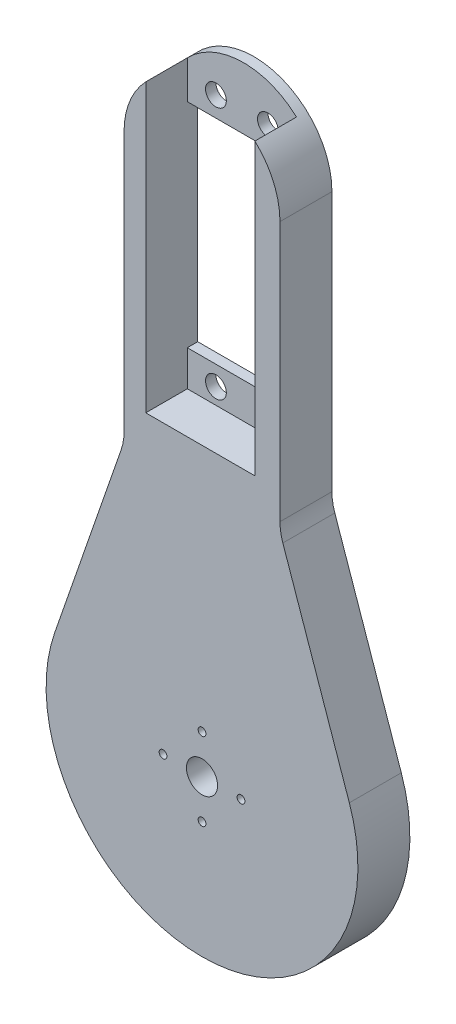
ISO-10303-21;
HEADER;
FILE_DESCRIPTION(('STEP AP214'),'2;1');
FILE_NAME('part.step','',(''),(''),'','','');
FILE_SCHEMA(('AUTOMOTIVE_DESIGN { 1 0 10303 214 1 1 1 1 }'));
ENDSEC;
DATA;
#1=APPLICATION_CONTEXT('core data for automotive mechanical design processes');
#2=APPLICATION_PROTOCOL_DEFINITION('international standard','automotive_design',2000,#1);
#3=PRODUCT_CONTEXT('',#1,'mechanical');
#4=PRODUCT('Part','Part','',(#3));
#5=PRODUCT_RELATED_PRODUCT_CATEGORY('part','',(#4));
#6=PRODUCT_DEFINITION_FORMATION('','',#4);
#7=PRODUCT_DEFINITION_CONTEXT('part definition',#1,'design');
#8=PRODUCT_DEFINITION('design','',#6,#7);
#9=PRODUCT_DEFINITION_SHAPE('','',#8);
#10=(LENGTH_UNIT() NAMED_UNIT(*) SI_UNIT(.MILLI.,.METRE.));
#11=(NAMED_UNIT(*) PLANE_ANGLE_UNIT() SI_UNIT($,.RADIAN.));
#12=(NAMED_UNIT(*) SI_UNIT($,.STERADIAN.) SOLID_ANGLE_UNIT());
#13=UNCERTAINTY_MEASURE_WITH_UNIT(LENGTH_MEASURE(1.E-05),#10,'distance_accuracy_value','');
#14=(GEOMETRIC_REPRESENTATION_CONTEXT(3) GLOBAL_UNCERTAINTY_ASSIGNED_CONTEXT((#13)) GLOBAL_UNIT_ASSIGNED_CONTEXT((#10,
#11,#12)) REPRESENTATION_CONTEXT('',''));
#15=CARTESIAN_POINT('',(0.,0.,0.));
#16=DIRECTION('',(0.,0.,1.));
#17=DIRECTION('',(1.,0.,0.));
#18=AXIS2_PLACEMENT_3D('',#15,#16,#17);
#19=CARTESIAN_POINT('',(0.,0.,2.));
#20=DIRECTION('',(0.,0.,1.));
#21=DIRECTION('',(1.,0.,0.));
#22=AXIS2_PLACEMENT_3D('',#19,#20,#21);
#23=PLANE('',#22);
#24=DIRECTION('',(0.,1.,0.));
#25=VECTOR('',#24,1.);
#26=CARTESIAN_POINT('',(-10.8232250608107,0.,2.));
#27=LINE('',#26,#25);
#28=CARTESIAN_POINT('',(-10.8232250608108,103.07930478499,2.));
#29=VERTEX_POINT('',#28);
#30=CARTESIAN_POINT('',(-10.8232250608108,110.385460956695,2.));
#31=VERTEX_POINT('',#30);
#32=EDGE_CURVE('E12',#29,#31,#27,.T.);
#33=ORIENTED_EDGE('',*,*,#32,.F.);
#34=DIRECTION('',(1.,0.,0.));
#35=VECTOR('',#34,1.);
#36=CARTESIAN_POINT('',(0.,103.07930478499,2.));
#37=LINE('',#36,#35);
#38=CARTESIAN_POINT('',(10.1767749391894,103.07930478499,2.));
#39=VERTEX_POINT('',#38);
#40=EDGE_CURVE('E430',#29,#39,#37,.T.);
#41=ORIENTED_EDGE('',*,*,#40,.T.);
#42=DIRECTION('',(0.,-1.,0.));
#43=VECTOR('',#42,1.);
#44=CARTESIAN_POINT('',(10.1767749391935,3.88577296002948E-13,2.));
#45=LINE('',#44,#43);
#46=CARTESIAN_POINT('',(10.1767749391893,111.019675668416,2.));
#47=VERTEX_POINT('',#46);
#48=EDGE_CURVE('E381',#47,#39,#45,.T.);
#49=ORIENTED_EDGE('',*,*,#48,.F.);
#50=CARTESIAN_POINT('',(0.,100.,2.));
#51=DIRECTION('',(0.,0.,1.));
#52=DIRECTION('',(1.,0.,0.));
#53=AXIS2_PLACEMENT_3D('',#50,#51,#52);
#54=CIRCLE('',#53,15.);
#55=EDGE_CURVE('E265',#47,#31,#54,.T.);
#56=ORIENTED_EDGE('',*,*,#55,.T.);
#57=EDGE_LOOP('',(#33,#41,#49,#56));
#58=FACE_BOUND('',#57,.T.);
#59=CARTESIAN_POINT('',(4.67677493918928,106.9585774249,2.));
#60=DIRECTION('',(0.,0.,1.));
#61=DIRECTION('',(1.,0.,0.));
#62=AXIS2_PLACEMENT_3D('',#59,#60,#61);
#63=CIRCLE('',#62,2.);
#64=CARTESIAN_POINT('',(6.67677493918928,106.9585774249,2.));
#65=VERTEX_POINT('',#64);
#66=EDGE_CURVE('E443',#65,#65,#63,.F.);
#67=ORIENTED_EDGE('',*,*,#66,.T.);
#68=EDGE_LOOP('',(#67));
#69=FACE_BOUND('',#68,.T.);
#70=CARTESIAN_POINT('',(-5.32322506081072,106.9585774249,2.));
#71=DIRECTION('',(0.,0.,1.));
#72=DIRECTION('',(1.,0.,0.));
#73=AXIS2_PLACEMENT_3D('',#70,#71,#72);
#74=CIRCLE('',#73,2.);
#75=CARTESIAN_POINT('',(-3.32322506081072,106.9585774249,2.));
#76=VERTEX_POINT('',#75);
#77=EDGE_CURVE('E440',#76,#76,#74,.T.);
#78=ORIENTED_EDGE('',*,*,#77,.F.);
#79=EDGE_LOOP('',(#78));
#80=FACE_BOUND('',#79,.T.);
#81=ADVANCED_FACE('F240',(#58,#69,#80),#23,.T.);
#82=CARTESIAN_POINT('',(0.,100.,2.));
#83=DIRECTION('',(0.,0.,-1.));
#84=DIRECTION('',(-1.,0.,0.));
#85=AXIS2_PLACEMENT_3D('',#82,#83,#84);
#86=CYLINDRICAL_SURFACE('',#85,15.);
#87=CARTESIAN_POINT('',(0.,100.,0.));
#88=DIRECTION('',(0.,0.,1.));
#89=DIRECTION('',(1.,0.,0.));
#90=AXIS2_PLACEMENT_3D('',#87,#88,#89);
#91=CIRCLE('',#90,15.);
#92=CARTESIAN_POINT('',(15.,100.,0.));
#93=VERTEX_POINT('',#92);
#94=CARTESIAN_POINT('',(-15.,100.,0.));
#95=VERTEX_POINT('',#94);
#96=EDGE_CURVE('E467',#93,#95,#91,.T.);
#97=ORIENTED_EDGE('',*,*,#96,.T.);
#98=DIRECTION('',(0.,0.,-1.));
#99=VECTOR('',#98,1.);
#100=CARTESIAN_POINT('',(-15.,100.,2.));
#101=LINE('',#100,#99);
#102=CARTESIAN_POINT('',(-15.,100.,10.));
#103=VERTEX_POINT('',#102);
#104=EDGE_CURVE('E515',#103,#95,#101,.T.);
#105=ORIENTED_EDGE('',*,*,#104,.F.);
#106=CARTESIAN_POINT('',(0.,100.,10.));
#107=DIRECTION('',(0.,0.,1.));
#108=DIRECTION('',(1.,0.,0.));
#109=AXIS2_PLACEMENT_3D('',#106,#107,#108);
#110=CIRCLE('',#109,15.);
#111=CARTESIAN_POINT('',(-10.8232250608108,110.385460956695,10.));
#112=VERTEX_POINT('',#111);
#113=EDGE_CURVE('E400',#112,#103,#110,.T.);
#114=ORIENTED_EDGE('',*,*,#113,.F.);
#115=DIRECTION('',(0.,0.,-1.));
#116=VECTOR('',#115,1.);
#117=CARTESIAN_POINT('',(-10.8232250608108,110.385460956695,10.));
#118=LINE('',#117,#116);
#119=EDGE_CURVE('E412',#112,#31,#118,.T.);
#120=ORIENTED_EDGE('',*,*,#119,.T.);
#121=ORIENTED_EDGE('',*,*,#55,.F.);
#122=DIRECTION('',(0.,0.,-1.));
#123=VECTOR('',#122,1.);
#124=CARTESIAN_POINT('',(10.1767749391893,111.019675668416,10.));
#125=LINE('',#124,#123);
#126=CARTESIAN_POINT('',(10.1767749391893,111.019675668416,10.));
#127=VERTEX_POINT('',#126);
#128=EDGE_CURVE('E415',#127,#47,#125,.T.);
#129=ORIENTED_EDGE('',*,*,#128,.F.);
#130=CARTESIAN_POINT('',(0.,100.,10.));
#131=DIRECTION('',(0.,0.,1.));
#132=DIRECTION('',(1.,0.,0.));
#133=AXIS2_PLACEMENT_3D('',#130,#131,#132);
#134=CIRCLE('',#133,15.);
#135=CARTESIAN_POINT('',(15.,100.,10.));
#136=VERTEX_POINT('',#135);
#137=EDGE_CURVE('E409',#136,#127,#134,.T.);
#138=ORIENTED_EDGE('',*,*,#137,.F.);
#139=DIRECTION('',(0.,0.,-1.));
#140=VECTOR('',#139,1.);
#141=CARTESIAN_POINT('',(15.,100.,2.));
#142=LINE('',#141,#140);
#143=EDGE_CURVE('E502',#136,#93,#142,.T.);
#144=ORIENTED_EDGE('',*,*,#143,.T.);
#145=EDGE_LOOP('',(#97,#105,#114,#120,#121,#129,#138,#144));
#146=FACE_BOUND('',#145,.T.);
#147=ADVANCED_FACE('F545',(#146),#86,.T.);
#148=CARTESIAN_POINT('',(-15.,0.,2.));
#149=DIRECTION('',(1.,0.,0.));
#150=DIRECTION('',(0.,1.,0.));
#151=AXIS2_PLACEMENT_3D('',#148,#149,#150);
#152=PLANE('',#151);
#153=DIRECTION('',(0.,-1.,0.));
#154=VECTOR('',#153,1.);
#155=CARTESIAN_POINT('',(-15.,0.,0.));
#156=LINE('',#155,#154);
#157=CARTESIAN_POINT('',(-15.,50.,0.));
#158=VERTEX_POINT('',#157);
#159=EDGE_CURVE('E470',#95,#158,#156,.T.);
#160=ORIENTED_EDGE('',*,*,#159,.T.);
#161=DIRECTION('',(0.,0.,-1.));
#162=VECTOR('',#161,1.);
#163=CARTESIAN_POINT('',(-15.,50.,2.));
#164=LINE('',#163,#162);
#165=CARTESIAN_POINT('',(-15.,50.,10.));
#166=VERTEX_POINT('',#165);
#167=EDGE_CURVE('E512',#166,#158,#164,.T.);
#168=ORIENTED_EDGE('',*,*,#167,.F.);
#169=DIRECTION('',(0.,1.,0.));
#170=VECTOR('',#169,1.);
#171=CARTESIAN_POINT('',(-15.,0.,10.));
#172=LINE('',#171,#170);
#173=EDGE_CURVE('E397',#166,#103,#172,.T.);
#174=ORIENTED_EDGE('',*,*,#173,.T.);
#175=ORIENTED_EDGE('',*,*,#104,.T.);
#176=EDGE_LOOP('',(#160,#168,#174,#175));
#177=FACE_BOUND('',#176,.T.);
#178=ADVANCED_FACE('F569',(#177),#152,.F.);
#179=CARTESIAN_POINT('',(-25.,50.,2.));
#180=DIRECTION('',(0.,0.,-1.));
#181=DIRECTION('',(-1.,0.,0.));
#182=AXIS2_PLACEMENT_3D('',#179,#180,#181);
#183=CYLINDRICAL_SURFACE('',#182,10.);
#184=CARTESIAN_POINT('',(-25.,50.,0.));
#185=DIRECTION('',(0.,0.,1.));
#186=DIRECTION('',(1.,0.,0.));
#187=AXIS2_PLACEMENT_3D('',#184,#185,#186);
#188=CIRCLE('',#187,10.);
#189=CARTESIAN_POINT('',(-15.5518002592746,46.7240998703627,0.));
#190=VERTEX_POINT('',#189);
#191=EDGE_CURVE('E472',#158,#190,#188,.F.);
#192=ORIENTED_EDGE('',*,*,#191,.T.);
#193=DIRECTION('',(0.,0.,-1.));
#194=VECTOR('',#193,1.);
#195=CARTESIAN_POINT('',(-15.5518002592746,46.7240998703627,2.));
#196=LINE('',#195,#194);
#197=CARTESIAN_POINT('',(-15.5518002592747,46.7240998703627,10.));
#198=VERTEX_POINT('',#197);
#199=EDGE_CURVE('E509',#198,#190,#196,.T.);
#200=ORIENTED_EDGE('',*,*,#199,.F.);
#201=CARTESIAN_POINT('',(-25.,50.,10.));
#202=DIRECTION('',(0.,0.,1.));
#203=DIRECTION('',(1.,0.,0.));
#204=AXIS2_PLACEMENT_3D('',#201,#202,#203);
#205=CIRCLE('',#204,10.);
#206=EDGE_CURVE('E394',#198,#166,#205,.T.);
#207=ORIENTED_EDGE('',*,*,#206,.T.);
#208=ORIENTED_EDGE('',*,*,#167,.T.);
#209=EDGE_LOOP('',(#192,#200,#207,#208));
#210=FACE_BOUND('',#209,.T.);
#211=ADVANCED_FACE('F566',(#210),#183,.F.);
#212=CARTESIAN_POINT('',(-28.344599222176,9.82770038891203,2.));
#213=DIRECTION('',(0.944819974072532,-0.327590012963734,0.));
#214=DIRECTION('',(0.327590012963734,0.944819974072532,0.));
#215=AXIS2_PLACEMENT_3D('',#212,#213,#214);
#216=PLANE('',#215);
#217=DIRECTION('',(-0.327590012963734,-0.944819974072532,0.));
#218=VECTOR('',#217,1.);
#219=CARTESIAN_POINT('',(-28.344599222176,9.82770038891203,0.));
#220=LINE('',#219,#218);
#221=CARTESIAN_POINT('',(-28.344599222176,9.82770038891202,0.));
#222=VERTEX_POINT('',#221);
#223=EDGE_CURVE('E474',#190,#222,#220,.T.);
#224=ORIENTED_EDGE('',*,*,#223,.T.);
#225=DIRECTION('',(0.,0.,-1.));
#226=VECTOR('',#225,1.);
#227=CARTESIAN_POINT('',(-28.344599222176,9.82770038891202,2.));
#228=LINE('',#227,#226);
#229=CARTESIAN_POINT('',(-28.344599222176,9.82770038891202,10.));
#230=VERTEX_POINT('',#229);
#231=EDGE_CURVE('E506',#230,#222,#228,.T.);
#232=ORIENTED_EDGE('',*,*,#231,.F.);
#233=DIRECTION('',(0.327590012963734,0.944819974072532,0.));
#234=VECTOR('',#233,1.);
#235=CARTESIAN_POINT('',(-28.344599222176,9.82770038891203,10.));
#236=LINE('',#235,#234);
#237=EDGE_CURVE('E391',#230,#198,#236,.T.);
#238=ORIENTED_EDGE('',*,*,#237,.T.);
#239=ORIENTED_EDGE('',*,*,#199,.T.);
#240=EDGE_LOOP('',(#224,#232,#238,#239));
#241=FACE_BOUND('',#240,.T.);
#242=ADVANCED_FACE('F563',(#241),#216,.F.);
#243=CARTESIAN_POINT('',(0.,0.,2.));
#244=DIRECTION('',(0.,0.,-1.));
#245=DIRECTION('',(-1.,0.,0.));
#246=AXIS2_PLACEMENT_3D('',#243,#244,#245);
#247=CYLINDRICAL_SURFACE('',#246,30.);
#248=CARTESIAN_POINT('',(0.,0.,0.));
#249=DIRECTION('',(0.,0.,1.));
#250=DIRECTION('',(1.,0.,0.));
#251=AXIS2_PLACEMENT_3D('',#248,#249,#250);
#252=CIRCLE('',#251,30.);
#253=CARTESIAN_POINT('',(28.344599222176,9.82770038891204,0.));
#254=VERTEX_POINT('',#253);
#255=EDGE_CURVE('E476',#222,#254,#252,.T.);
#256=ORIENTED_EDGE('',*,*,#255,.T.);
#257=DIRECTION('',(0.,0.,-1.));
#258=VECTOR('',#257,1.);
#259=CARTESIAN_POINT('',(28.344599222176,9.82770038891204,2.));
#260=LINE('',#259,#258);
#261=CARTESIAN_POINT('',(28.344599222176,9.82770038891203,10.));
#262=VERTEX_POINT('',#261);
#263=EDGE_CURVE('E365',#262,#254,#260,.T.);
#264=ORIENTED_EDGE('',*,*,#263,.F.);
#265=CARTESIAN_POINT('',(0.,0.,10.));
#266=DIRECTION('',(0.,0.,1.));
#267=DIRECTION('',(1.,0.,0.));
#268=AXIS2_PLACEMENT_3D('',#265,#266,#267);
#269=CIRCLE('',#268,30.);
#270=EDGE_CURVE('E377',#230,#262,#269,.T.);
#271=ORIENTED_EDGE('',*,*,#270,.F.);
#272=ORIENTED_EDGE('',*,*,#231,.T.);
#273=EDGE_LOOP('',(#256,#264,#271,#272));
#274=FACE_BOUND('',#273,.T.);
#275=ADVANCED_FACE('F561',(#274),#247,.T.);
#276=CARTESIAN_POINT('',(28.344599222176,9.82770038891204,2.));
#277=DIRECTION('',(0.944819974072532,0.327590012963735,0.));
#278=DIRECTION('',(-0.327590012963735,0.944819974072532,0.));
#279=AXIS2_PLACEMENT_3D('',#276,#277,#278);
#280=PLANE('',#279);
#281=DIRECTION('',(0.327590012963735,-0.944819974072532,0.));
#282=VECTOR('',#281,1.);
#283=CARTESIAN_POINT('',(28.344599222176,9.82770038891204,0.));
#284=LINE('',#283,#282);
#285=CARTESIAN_POINT('',(15.5518002592747,46.7240998703627,0.));
#286=VERTEX_POINT('',#285);
#287=EDGE_CURVE('E360',#286,#254,#284,.T.);
#288=ORIENTED_EDGE('',*,*,#287,.F.);
#289=DIRECTION('',(0.,0.,-1.));
#290=VECTOR('',#289,1.);
#291=CARTESIAN_POINT('',(15.5518002592747,46.7240998703627,2.));
#292=LINE('',#291,#290);
#293=CARTESIAN_POINT('',(15.5518002592746,46.7240998703627,10.));
#294=VERTEX_POINT('',#293);
#295=EDGE_CURVE('E355',#294,#286,#292,.T.);
#296=ORIENTED_EDGE('',*,*,#295,.F.);
#297=DIRECTION('',(-0.327590012963735,0.944819974072532,0.));
#298=VECTOR('',#297,1.);
#299=CARTESIAN_POINT('',(28.344599222176,9.82770038891204,10.));
#300=LINE('',#299,#298);
#301=EDGE_CURVE('E358',#262,#294,#300,.T.);
#302=ORIENTED_EDGE('',*,*,#301,.F.);
#303=ORIENTED_EDGE('',*,*,#263,.T.);
#304=EDGE_LOOP('',(#288,#296,#302,#303));
#305=FACE_BOUND('',#304,.T.);
#306=ADVANCED_FACE('F357',(#305),#280,.T.);
#307=CARTESIAN_POINT('',(25.,50.,2.));
#308=DIRECTION('',(0.,0.,-1.));
#309=DIRECTION('',(-1.,0.,0.));
#310=AXIS2_PLACEMENT_3D('',#307,#308,#309);
#311=CYLINDRICAL_SURFACE('',#310,10.);
#312=CARTESIAN_POINT('',(25.,50.,0.));
#313=DIRECTION('',(0.,0.,1.));
#314=DIRECTION('',(1.,0.,0.));
#315=AXIS2_PLACEMENT_3D('',#312,#313,#314);
#316=CIRCLE('',#315,10.);
#317=CARTESIAN_POINT('',(15.,50.,0.));
#318=VERTEX_POINT('',#317);
#319=EDGE_CURVE('E480',#318,#286,#316,.T.);
#320=ORIENTED_EDGE('',*,*,#319,.F.);
#321=DIRECTION('',(0.,0.,-1.));
#322=VECTOR('',#321,1.);
#323=CARTESIAN_POINT('',(15.,50.,2.));
#324=LINE('',#323,#322);
#325=CARTESIAN_POINT('',(15.,50.,10.));
#326=VERTEX_POINT('',#325);
#327=EDGE_CURVE('E366',#326,#318,#324,.T.);
#328=ORIENTED_EDGE('',*,*,#327,.F.);
#329=CARTESIAN_POINT('',(25.,50.,10.));
#330=DIRECTION('',(0.,0.,1.));
#331=DIRECTION('',(1.,0.,0.));
#332=AXIS2_PLACEMENT_3D('',#329,#330,#331);
#333=CIRCLE('',#332,10.);
#334=EDGE_CURVE('E374',#326,#294,#333,.T.);
#335=ORIENTED_EDGE('',*,*,#334,.T.);
#336=ORIENTED_EDGE('',*,*,#295,.T.);
#337=EDGE_LOOP('',(#320,#328,#335,#336));
#338=FACE_BOUND('',#337,.T.);
#339=ADVANCED_FACE('F379',(#338),#311,.F.);
#340=CARTESIAN_POINT('',(10.1767749391935,3.88577296002948E-13,2.));
#341=DIRECTION('',(-1.,0.,0.));
#342=DIRECTION('',(0.,-1.,0.));
#343=AXIS2_PLACEMENT_3D('',#340,#341,#342);
#344=PLANE('',#343);
#345=DIRECTION('',(0.,1.,0.));
#346=VECTOR('',#345,1.);
#347=CARTESIAN_POINT('',(10.1767749391935,3.88577296002948E-13,0.));
#348=LINE('',#347,#346);
#349=CARTESIAN_POINT('',(10.1767749391902,62.0793047849904,0.));
#350=VERTEX_POINT('',#349);
#351=CARTESIAN_POINT('',(10.1767749391894,103.07930478499,0.));
#352=VERTEX_POINT('',#351);
#353=EDGE_CURVE('E455',#350,#352,#348,.T.);
#354=ORIENTED_EDGE('',*,*,#353,.F.);
#355=DIRECTION('',(0.,0.,-1.));
#356=VECTOR('',#355,1.);
#357=CARTESIAN_POINT('',(10.1767749391902,62.0793047849904,2.));
#358=LINE('',#357,#356);
#359=CARTESIAN_POINT('',(10.1767749391902,62.0793047849904,2.));
#360=VERTEX_POINT('',#359);
#361=EDGE_CURVE('E244',#360,#350,#358,.T.);
#362=ORIENTED_EDGE('',*,*,#361,.F.);
#363=CARTESIAN_POINT('',(10.1767749391914,55.2293047849904,2.));
#364=VERTEX_POINT('',#363);
#365=EDGE_CURVE('E249',#360,#364,#45,.T.);
#366=ORIENTED_EDGE('',*,*,#365,.T.);
#367=DIRECTION('',(0.,0.,-1.));
#368=VECTOR('',#367,1.);
#369=CARTESIAN_POINT('',(10.1767749391914,55.2293047849904,10.));
#370=LINE('',#369,#368);
#371=CARTESIAN_POINT('',(10.1767749391914,55.2293047849904,10.));
#372=VERTEX_POINT('',#371);
#373=EDGE_CURVE('E419',#372,#364,#370,.T.);
#374=ORIENTED_EDGE('',*,*,#373,.F.);
#375=DIRECTION('',(0.,-1.,0.));
#376=VECTOR('',#375,1.);
#377=CARTESIAN_POINT('',(10.1767749391935,3.88577296002948E-13,10.));
#378=LINE('',#377,#376);
#379=EDGE_CURVE('E407',#127,#372,#378,.T.);
#380=ORIENTED_EDGE('',*,*,#379,.F.);
#381=ORIENTED_EDGE('',*,*,#128,.T.);
#382=ORIENTED_EDGE('',*,*,#48,.T.);
#383=DIRECTION('',(0.,0.,-1.));
#384=VECTOR('',#383,1.);
#385=CARTESIAN_POINT('',(10.1767749391894,103.07930478499,2.));
#386=LINE('',#385,#384);
#387=EDGE_CURVE('E446',#39,#352,#386,.T.);
#388=ORIENTED_EDGE('',*,*,#387,.T.);
#389=EDGE_LOOP('',(#354,#362,#366,#374,#380,#381,#382,#388));
#390=FACE_BOUND('',#389,.T.);
#391=ADVANCED_FACE('F530',(#390),#344,.T.);
#392=CARTESIAN_POINT('',(0.,62.0793047849904,2.));
#393=DIRECTION('',(0.,1.,0.));
#394=DIRECTION('',(-1.,0.,0.));
#395=AXIS2_PLACEMENT_3D('',#392,#393,#394);
#396=PLANE('',#395);
#397=DIRECTION('',(1.,0.,0.));
#398=VECTOR('',#397,1.);
#399=CARTESIAN_POINT('',(0.,62.0793047849904,0.));
#400=LINE('',#399,#398);
#401=CARTESIAN_POINT('',(-10.8232250608107,62.0793047849904,0.));
#402=VERTEX_POINT('',#401);
#403=EDGE_CURVE('E458',#402,#350,#400,.T.);
#404=ORIENTED_EDGE('',*,*,#403,.F.);
#405=DIRECTION('',(0.,0.,-1.));
#406=VECTOR('',#405,1.);
#407=CARTESIAN_POINT('',(-10.8232250608107,62.0793047849904,2.));
#408=LINE('',#407,#406);
#409=CARTESIAN_POINT('',(-10.8232250608107,62.0793047849904,2.));
#410=VERTEX_POINT('',#409);
#411=EDGE_CURVE('E520',#410,#402,#408,.T.);
#412=ORIENTED_EDGE('',*,*,#411,.F.);
#413=DIRECTION('',(1.,0.,0.));
#414=VECTOR('',#413,1.);
#415=CARTESIAN_POINT('',(0.,62.0793047849904,2.));
#416=LINE('',#415,#414);
#417=EDGE_CURVE('E427',#410,#360,#416,.T.);
#418=ORIENTED_EDGE('',*,*,#417,.T.);
#419=ORIENTED_EDGE('',*,*,#361,.T.);
#420=EDGE_LOOP('',(#404,#412,#418,#419));
#421=FACE_BOUND('',#420,.T.);
#422=ADVANCED_FACE('F527',(#421),#396,.T.);
#423=CARTESIAN_POINT('',(-10.8232250608107,0.,2.));
#424=DIRECTION('',(1.,0.,0.));
#425=DIRECTION('',(0.,1.,0.));
#426=AXIS2_PLACEMENT_3D('',#423,#424,#425);
#427=PLANE('',#426);
#428=DIRECTION('',(0.,-1.,0.));
#429=VECTOR('',#428,1.);
#430=CARTESIAN_POINT('',(-10.8232250608107,0.,0.));
#431=LINE('',#430,#429);
#432=CARTESIAN_POINT('',(-10.8232250608108,103.07930478499,0.));
#433=VERTEX_POINT('',#432);
#434=EDGE_CURVE('E461',#433,#402,#431,.T.);
#435=ORIENTED_EDGE('',*,*,#434,.F.);
#436=DIRECTION('',(0.,0.,-1.));
#437=VECTOR('',#436,1.);
#438=CARTESIAN_POINT('',(-10.8232250608108,103.07930478499,2.));
#439=LINE('',#438,#437);
#440=EDGE_CURVE('E519',#29,#433,#439,.T.);
#441=ORIENTED_EDGE('',*,*,#440,.F.);
#442=ORIENTED_EDGE('',*,*,#32,.T.);
#443=ORIENTED_EDGE('',*,*,#119,.F.);
#444=DIRECTION('',(0.,1.,0.));
#445=VECTOR('',#444,1.);
#446=CARTESIAN_POINT('',(-10.8232250608107,0.,10.));
#447=LINE('',#446,#445);
#448=CARTESIAN_POINT('',(-10.8232250608107,55.2293047849904,10.));
#449=VERTEX_POINT('',#448);
#450=EDGE_CURVE('E403',#449,#112,#447,.T.);
#451=ORIENTED_EDGE('',*,*,#450,.F.);
#452=DIRECTION('',(0.,0.,-1.));
#453=VECTOR('',#452,1.);
#454=CARTESIAN_POINT('',(-10.8232250608107,55.2293047849904,10.));
#455=LINE('',#454,#453);
#456=CARTESIAN_POINT('',(-10.8232250608107,55.2293047849904,2.));
#457=VERTEX_POINT('',#456);
#458=EDGE_CURVE('E422',#449,#457,#455,.T.);
#459=ORIENTED_EDGE('',*,*,#458,.T.);
#460=EDGE_CURVE('E251',#457,#410,#27,.T.);
#461=ORIENTED_EDGE('',*,*,#460,.T.);
#462=ORIENTED_EDGE('',*,*,#411,.T.);
#463=EDGE_LOOP('',(#435,#441,#442,#443,#451,#459,#461,#462));
#464=FACE_BOUND('',#463,.T.);
#465=ADVANCED_FACE('F537',(#464),#427,.T.);
#466=CARTESIAN_POINT('',(4.67677493918928,106.9585774249,2.));
#467=DIRECTION('',(0.,0.,-1.));
#468=DIRECTION('',(-1.,0.,0.));
#469=AXIS2_PLACEMENT_3D('',#466,#467,#468);
#470=CYLINDRICAL_SURFACE('',#469,2.);
#471=ORIENTED_EDGE('',*,*,#66,.F.);
#472=EDGE_LOOP('',(#471));
#473=FACE_BOUND('',#472,.T.);
#474=CARTESIAN_POINT('',(4.67677493918928,106.9585774249,0.));
#475=DIRECTION('',(0.,0.,1.));
#476=DIRECTION('',(1.,0.,0.));
#477=AXIS2_PLACEMENT_3D('',#474,#475,#476);
#478=CIRCLE('',#477,2.);
#479=CARTESIAN_POINT('',(6.67677493918928,106.9585774249,0.));
#480=VERTEX_POINT('',#479);
#481=EDGE_CURVE('E497',#480,#480,#478,.F.);
#482=ORIENTED_EDGE('',*,*,#481,.T.);
#483=EDGE_LOOP('',(#482));
#484=FACE_BOUND('',#483,.T.);
#485=ADVANCED_FACE('F662',(#473,#484),#470,.F.);
#486=CARTESIAN_POINT('',(-5.32322506081072,106.9585774249,2.));
#487=DIRECTION('',(0.,0.,-1.));
#488=DIRECTION('',(-1.,0.,0.));
#489=AXIS2_PLACEMENT_3D('',#486,#487,#488);
#490=CYLINDRICAL_SURFACE('',#489,2.);
#491=ORIENTED_EDGE('',*,*,#77,.T.);
#492=EDGE_LOOP('',(#491));
#493=FACE_BOUND('',#492,.T.);
#494=CARTESIAN_POINT('',(-5.32322506081072,106.9585774249,0.));
#495=DIRECTION('',(0.,0.,1.));
#496=DIRECTION('',(1.,0.,0.));
#497=AXIS2_PLACEMENT_3D('',#494,#495,#496);
#498=CIRCLE('',#497,2.);
#499=CARTESIAN_POINT('',(-3.32322506081072,106.9585774249,0.));
#500=VERTEX_POINT('',#499);
#501=EDGE_CURVE('E494',#500,#500,#498,.T.);
#502=ORIENTED_EDGE('',*,*,#501,.F.);
#503=EDGE_LOOP('',(#502));
#504=FACE_BOUND('',#503,.T.);
#505=ADVANCED_FACE('F604',(#493,#504),#490,.F.);
#506=CARTESIAN_POINT('',(4.67677493918928,58.3285774248997,2.));
#507=DIRECTION('',(0.,0.,-1.));
#508=DIRECTION('',(-1.,0.,0.));
#509=AXIS2_PLACEMENT_3D('',#506,#507,#508);
#510=CYLINDRICAL_SURFACE('',#509,2.);
#511=CARTESIAN_POINT('',(4.67677493918928,58.3285774248997,2.));
#512=DIRECTION('',(0.,0.,1.));
#513=DIRECTION('',(1.,0.,0.));
#514=AXIS2_PLACEMENT_3D('',#511,#512,#513);
#515=CIRCLE('',#514,2.);
#516=CARTESIAN_POINT('',(6.67677493918929,58.3285774248997,2.));
#517=VERTEX_POINT('',#516);
#518=EDGE_CURVE('E437',#517,#517,#515,.F.);
#519=ORIENTED_EDGE('',*,*,#518,.F.);
#520=EDGE_LOOP('',(#519));
#521=FACE_BOUND('',#520,.T.);
#522=CARTESIAN_POINT('',(4.67677493918928,58.3285774248997,0.));
#523=DIRECTION('',(0.,0.,1.));
#524=DIRECTION('',(1.,0.,0.));
#525=AXIS2_PLACEMENT_3D('',#522,#523,#524);
#526=CIRCLE('',#525,2.);
#527=CARTESIAN_POINT('',(6.67677493918929,58.3285774248997,0.));
#528=VERTEX_POINT('',#527);
#529=EDGE_CURVE('E491',#528,#528,#526,.F.);
#530=ORIENTED_EDGE('',*,*,#529,.T.);
#531=EDGE_LOOP('',(#530));
#532=FACE_BOUND('',#531,.T.);
#533=ADVANCED_FACE('F600',(#521,#532),#510,.F.);
#534=CARTESIAN_POINT('',(-5.32322506081072,58.3285774248997,2.));
#535=DIRECTION('',(0.,0.,-1.));
#536=DIRECTION('',(-1.,0.,0.));
#537=AXIS2_PLACEMENT_3D('',#534,#535,#536);
#538=CYLINDRICAL_SURFACE('',#537,2.00000000000001);
#539=CARTESIAN_POINT('',(-5.32322506081072,58.3285774248997,2.));
#540=DIRECTION('',(0.,0.,1.));
#541=DIRECTION('',(1.,0.,0.));
#542=AXIS2_PLACEMENT_3D('',#539,#540,#541);
#543=CIRCLE('',#542,2.00000000000001);
#544=CARTESIAN_POINT('',(-3.32322506081071,58.3285774248997,2.));
#545=VERTEX_POINT('',#544);
#546=EDGE_CURVE('E434',#545,#545,#543,.T.);
#547=ORIENTED_EDGE('',*,*,#546,.T.);
#548=EDGE_LOOP('',(#547));
#549=FACE_BOUND('',#548,.T.);
#550=CARTESIAN_POINT('',(-5.32322506081072,58.3285774248997,0.));
#551=DIRECTION('',(0.,0.,1.));
#552=DIRECTION('',(1.,0.,0.));
#553=AXIS2_PLACEMENT_3D('',#550,#551,#552);
#554=CIRCLE('',#553,2.00000000000001);
#555=CARTESIAN_POINT('',(-3.32322506081071,58.3285774248997,0.));
#556=VERTEX_POINT('',#555);
#557=EDGE_CURVE('E488',#556,#556,#554,.T.);
#558=ORIENTED_EDGE('',*,*,#557,.F.);
#559=EDGE_LOOP('',(#558));
#560=FACE_BOUND('',#559,.T.);
#561=ADVANCED_FACE('F603',(#549,#560),#538,.F.);
#562=CARTESIAN_POINT('',(0.,7.5,2.));
#563=DIRECTION('',(0.,0.,-1.));
#564=DIRECTION('',(-1.,0.,0.));
#565=AXIS2_PLACEMENT_3D('',#562,#563,#564);
#566=CYLINDRICAL_SURFACE('',#565,0.75);
#567=CARTESIAN_POINT('',(0.,7.5,0.));
#568=DIRECTION('',(0.,0.,1.));
#569=DIRECTION('',(1.,0.,0.));
#570=AXIS2_PLACEMENT_3D('',#567,#568,#569);
#571=CIRCLE('',#570,0.75);
#572=CARTESIAN_POINT('',(0.750000000000052,7.5,0.));
#573=VERTEX_POINT('',#572);
#574=EDGE_CURVE('E485',#573,#573,#571,.T.);
#575=ORIENTED_EDGE('',*,*,#574,.F.);
#576=EDGE_LOOP('',(#575));
#577=FACE_BOUND('',#576,.T.);
#578=CARTESIAN_POINT('',(0.,7.5,10.));
#579=DIRECTION('',(0.,0.,1.));
#580=DIRECTION('',(1.,0.,0.));
#581=AXIS2_PLACEMENT_3D('',#578,#579,#580);
#582=CIRCLE('',#581,0.75);
#583=CARTESIAN_POINT('',(0.750000000000052,7.5,10.));
#584=VERTEX_POINT('',#583);
#585=EDGE_CURVE('E617',#584,#584,#582,.T.);
#586=ORIENTED_EDGE('',*,*,#585,.T.);
#587=EDGE_LOOP('',(#586));
#588=FACE_BOUND('',#587,.T.);
#589=ADVANCED_FACE('F667',(#577,#588),#566,.F.);
#590=CARTESIAN_POINT('',(15.,0.,2.));
#591=DIRECTION('',(1.,0.,0.));
#592=DIRECTION('',(0.,1.,0.));
#593=AXIS2_PLACEMENT_3D('',#590,#591,#592);
#594=PLANE('',#593);
#595=DIRECTION('',(0.,-1.,0.));
#596=VECTOR('',#595,1.);
#597=CARTESIAN_POINT('',(15.,0.,0.));
#598=LINE('',#597,#596);
#599=EDGE_CURVE('E482',#93,#318,#598,.T.);
#600=ORIENTED_EDGE('',*,*,#599,.F.);
#601=ORIENTED_EDGE('',*,*,#143,.F.);
#602=DIRECTION('',(0.,1.,0.));
#603=VECTOR('',#602,1.);
#604=CARTESIAN_POINT('',(15.,0.,10.));
#605=LINE('',#604,#603);
#606=EDGE_CURVE('E411',#326,#136,#605,.T.);
#607=ORIENTED_EDGE('',*,*,#606,.F.);
#608=ORIENTED_EDGE('',*,*,#327,.T.);
#609=EDGE_LOOP('',(#600,#601,#607,#608));
#610=FACE_BOUND('',#609,.T.);
#611=ADVANCED_FACE('F557',(#610),#594,.T.);
#612=CARTESIAN_POINT('',(0.,103.07930478499,2.));
#613=DIRECTION('',(0.,1.,0.));
#614=DIRECTION('',(0.,0.,1.));
#615=AXIS2_PLACEMENT_3D('',#612,#613,#614);
#616=PLANE('',#615);
#617=DIRECTION('',(1.,0.,0.));
#618=VECTOR('',#617,1.);
#619=CARTESIAN_POINT('',(0.,103.07930478499,0.));
#620=LINE('',#619,#618);
#621=EDGE_CURVE('E464',#433,#352,#620,.T.);
#622=ORIENTED_EDGE('',*,*,#621,.T.);
#623=ORIENTED_EDGE('',*,*,#387,.F.);
#624=ORIENTED_EDGE('',*,*,#40,.F.);
#625=ORIENTED_EDGE('',*,*,#440,.T.);
#626=EDGE_LOOP('',(#622,#623,#624,#625));
#627=FACE_BOUND('',#626,.T.);
#628=ADVANCED_FACE('F541',(#627),#616,.F.);
#629=CARTESIAN_POINT('',(-7.5,0.,2.));
#630=DIRECTION('',(0.,0.,-1.));
#631=DIRECTION('',(-1.,0.,0.));
#632=AXIS2_PLACEMENT_3D('',#629,#630,#631);
#633=CYLINDRICAL_SURFACE('',#632,0.75);
#634=CARTESIAN_POINT('',(-7.5,0.,0.));
#635=DIRECTION('',(0.,0.,1.));
#636=DIRECTION('',(1.,0.,0.));
#637=AXIS2_PLACEMENT_3D('',#634,#635,#636);
#638=CIRCLE('',#637,0.75);
#639=CARTESIAN_POINT('',(-6.75,0.,0.));
#640=VERTEX_POINT('',#639);
#641=EDGE_CURVE('E452',#640,#640,#638,.T.);
#642=ORIENTED_EDGE('',*,*,#641,.F.);
#643=EDGE_LOOP('',(#642));
#644=FACE_BOUND('',#643,.T.);
#645=CARTESIAN_POINT('',(-7.5,0.,10.));
#646=DIRECTION('',(0.,0.,1.));
#647=DIRECTION('',(1.,0.,0.));
#648=AXIS2_PLACEMENT_3D('',#645,#646,#647);
#649=CIRCLE('',#648,0.75);
#650=CARTESIAN_POINT('',(-6.75,0.,10.));
#651=VERTEX_POINT('',#650);
#652=EDGE_CURVE('E619',#651,#651,#649,.T.);
#653=ORIENTED_EDGE('',*,*,#652,.T.);
#654=EDGE_LOOP('',(#653));
#655=FACE_BOUND('',#654,.T.);
#656=ADVANCED_FACE('F645',(#644,#655),#633,.F.);
#657=CARTESIAN_POINT('',(0.,-7.5,2.));
#658=DIRECTION('',(0.,0.,-1.));
#659=DIRECTION('',(-1.,0.,0.));
#660=AXIS2_PLACEMENT_3D('',#657,#658,#659);
#661=CYLINDRICAL_SURFACE('',#660,0.75);
#662=CARTESIAN_POINT('',(0.,-7.5,0.));
#663=DIRECTION('',(0.,0.,1.));
#664=DIRECTION('',(1.,0.,0.));
#665=AXIS2_PLACEMENT_3D('',#662,#663,#664);
#666=CIRCLE('',#665,0.75);
#667=CARTESIAN_POINT('',(0.75,-7.5,0.));
#668=VERTEX_POINT('',#667);
#669=EDGE_CURVE('E449',#668,#668,#666,.T.);
#670=ORIENTED_EDGE('',*,*,#669,.F.);
#671=EDGE_LOOP('',(#670));
#672=FACE_BOUND('',#671,.T.);
#673=CARTESIAN_POINT('',(0.,-7.5,10.));
#674=DIRECTION('',(0.,0.,1.));
#675=DIRECTION('',(1.,0.,0.));
#676=AXIS2_PLACEMENT_3D('',#673,#674,#675);
#677=CIRCLE('',#676,0.75);
#678=CARTESIAN_POINT('',(0.75,-7.5,10.));
#679=VERTEX_POINT('',#678);
#680=EDGE_CURVE('E623',#679,#679,#677,.T.);
#681=ORIENTED_EDGE('',*,*,#680,.T.);
#682=EDGE_LOOP('',(#681));
#683=FACE_BOUND('',#682,.T.);
#684=ADVANCED_FACE('F643',(#672,#683),#661,.F.);
#685=CARTESIAN_POINT('',(7.5,0.,2.));
#686=DIRECTION('',(0.,0.,-1.));
#687=DIRECTION('',(-1.,0.,0.));
#688=AXIS2_PLACEMENT_3D('',#685,#686,#687);
#689=CYLINDRICAL_SURFACE('',#688,0.749999999999999);
#690=CARTESIAN_POINT('',(7.5,0.,0.));
#691=DIRECTION('',(0.,0.,1.));
#692=DIRECTION('',(1.,0.,0.));
#693=AXIS2_PLACEMENT_3D('',#690,#691,#692);
#694=CIRCLE('',#693,0.749999999999999);
#695=CARTESIAN_POINT('',(8.25,0.,0.));
#696=VERTEX_POINT('',#695);
#697=EDGE_CURVE('E418',#696,#696,#694,.T.);
#698=ORIENTED_EDGE('',*,*,#697,.F.);
#699=EDGE_LOOP('',(#698));
#700=FACE_BOUND('',#699,.T.);
#701=CARTESIAN_POINT('',(7.5,0.,10.));
#702=DIRECTION('',(0.,0.,1.));
#703=DIRECTION('',(1.,0.,0.));
#704=AXIS2_PLACEMENT_3D('',#701,#702,#703);
#705=CIRCLE('',#704,0.749999999999999);
#706=CARTESIAN_POINT('',(8.25,0.,10.));
#707=VERTEX_POINT('',#706);
#708=EDGE_CURVE('E628',#707,#707,#705,.T.);
#709=ORIENTED_EDGE('',*,*,#708,.T.);
#710=EDGE_LOOP('',(#709));
#711=FACE_BOUND('',#710,.T.);
#712=ADVANCED_FACE('F242',(#700,#711),#689,.F.);
#713=CARTESIAN_POINT('',(0.,0.,2.));
#714=DIRECTION('',(0.,0.,-1.));
#715=DIRECTION('',(-1.,0.,0.));
#716=AXIS2_PLACEMENT_3D('',#713,#714,#715);
#717=CYLINDRICAL_SURFACE('',#716,3.);
#718=CARTESIAN_POINT('',(0.,0.,0.));
#719=DIRECTION('',(0.,0.,1.));
#720=DIRECTION('',(1.,0.,0.));
#721=AXIS2_PLACEMENT_3D('',#718,#719,#720);
#722=CIRCLE('',#721,3.);
#723=CARTESIAN_POINT('',(3.,0.,0.));
#724=VERTEX_POINT('',#723);
#725=EDGE_CURVE('E431',#724,#724,#722,.T.);
#726=ORIENTED_EDGE('',*,*,#725,.F.);
#727=EDGE_LOOP('',(#726));
#728=FACE_BOUND('',#727,.T.);
#729=CARTESIAN_POINT('',(0.,0.,10.));
#730=DIRECTION('',(0.,0.,1.));
#731=DIRECTION('',(1.,0.,0.));
#732=AXIS2_PLACEMENT_3D('',#729,#730,#731);
#733=CIRCLE('',#732,3.);
#734=CARTESIAN_POINT('',(3.,0.,10.));
#735=VERTEX_POINT('',#734);
#736=EDGE_CURVE('E387',#735,#735,#733,.T.);
#737=ORIENTED_EDGE('',*,*,#736,.T.);
#738=EDGE_LOOP('',(#737));
#739=FACE_BOUND('',#738,.T.);
#740=ADVANCED_FACE('F587',(#728,#739),#717,.F.);
#741=ORIENTED_EDGE('',*,*,#460,.F.);
#742=DIRECTION('',(-1.,0.,0.));
#743=VECTOR('',#742,1.);
#744=CARTESIAN_POINT('',(0.,55.2293047849904,2.));
#745=LINE('',#744,#743);
#746=EDGE_CURVE('E384',#364,#457,#745,.T.);
#747=ORIENTED_EDGE('',*,*,#746,.F.);
#748=ORIENTED_EDGE('',*,*,#365,.F.);
#749=ORIENTED_EDGE('',*,*,#417,.F.);
#750=EDGE_LOOP('',(#741,#747,#748,#749));
#751=FACE_BOUND('',#750,.T.);
#752=ORIENTED_EDGE('',*,*,#546,.F.);
#753=EDGE_LOOP('',(#752));
#754=FACE_BOUND('',#753,.T.);
#755=ORIENTED_EDGE('',*,*,#518,.T.);
#756=EDGE_LOOP('',(#755));
#757=FACE_BOUND('',#756,.T.);
#758=ADVANCED_FACE('F580',(#751,#754,#757),#23,.T.);
#759=CARTESIAN_POINT('',(0.,0.,0.));
#760=DIRECTION('',(0.,0.,1.));
#761=DIRECTION('',(1.,0.,0.));
#762=AXIS2_PLACEMENT_3D('',#759,#760,#761);
#763=PLANE('',#762);
#764=ORIENTED_EDGE('',*,*,#697,.T.);
#765=EDGE_LOOP('',(#764));
#766=FACE_BOUND('',#765,.T.);
#767=ORIENTED_EDGE('',*,*,#669,.T.);
#768=EDGE_LOOP('',(#767));
#769=FACE_BOUND('',#768,.T.);
#770=ORIENTED_EDGE('',*,*,#641,.T.);
#771=EDGE_LOOP('',(#770));
#772=FACE_BOUND('',#771,.T.);
#773=ORIENTED_EDGE('',*,*,#353,.T.);
#774=ORIENTED_EDGE('',*,*,#621,.F.);
#775=ORIENTED_EDGE('',*,*,#434,.T.);
#776=ORIENTED_EDGE('',*,*,#403,.T.);
#777=EDGE_LOOP('',(#773,#774,#775,#776));
#778=FACE_BOUND('',#777,.T.);
#779=ORIENTED_EDGE('',*,*,#96,.F.);
#780=ORIENTED_EDGE('',*,*,#599,.T.);
#781=ORIENTED_EDGE('',*,*,#319,.T.);
#782=ORIENTED_EDGE('',*,*,#287,.T.);
#783=ORIENTED_EDGE('',*,*,#255,.F.);
#784=ORIENTED_EDGE('',*,*,#223,.F.);
#785=ORIENTED_EDGE('',*,*,#191,.F.);
#786=ORIENTED_EDGE('',*,*,#159,.F.);
#787=EDGE_LOOP('',(#779,#780,#781,#782,#783,#784,#785,#786));
#788=FACE_BOUND('',#787,.T.);
#789=ORIENTED_EDGE('',*,*,#574,.T.);
#790=EDGE_LOOP('',(#789));
#791=FACE_BOUND('',#790,.T.);
#792=ORIENTED_EDGE('',*,*,#557,.T.);
#793=EDGE_LOOP('',(#792));
#794=FACE_BOUND('',#793,.T.);
#795=ORIENTED_EDGE('',*,*,#529,.F.);
#796=EDGE_LOOP('',(#795));
#797=FACE_BOUND('',#796,.T.);
#798=ORIENTED_EDGE('',*,*,#501,.T.);
#799=EDGE_LOOP('',(#798));
#800=FACE_BOUND('',#799,.T.);
#801=ORIENTED_EDGE('',*,*,#481,.F.);
#802=EDGE_LOOP('',(#801));
#803=FACE_BOUND('',#802,.T.);
#804=ORIENTED_EDGE('',*,*,#725,.T.);
#805=EDGE_LOOP('',(#804));
#806=FACE_BOUND('',#805,.T.);
#807=ADVANCED_FACE('F534',(#766,#769,#772,#778,#788,#791,#794,#797,#800,#803,#806),#763,.F.);
#808=CARTESIAN_POINT('',(25.,50.,10.));
#809=DIRECTION('',(0.,0.,1.));
#810=DIRECTION('',(1.,0.,0.));
#811=AXIS2_PLACEMENT_3D('',#808,#809,#810);
#812=PLANE('',#811);
#813=ORIENTED_EDGE('',*,*,#680,.F.);
#814=EDGE_LOOP('',(#813));
#815=FACE_BOUND('',#814,.T.);
#816=ORIENTED_EDGE('',*,*,#585,.F.);
#817=EDGE_LOOP('',(#816));
#818=FACE_BOUND('',#817,.T.);
#819=ORIENTED_EDGE('',*,*,#334,.F.);
#820=ORIENTED_EDGE('',*,*,#606,.T.);
#821=ORIENTED_EDGE('',*,*,#137,.T.);
#822=ORIENTED_EDGE('',*,*,#379,.T.);
#823=DIRECTION('',(-1.,0.,0.));
#824=VECTOR('',#823,1.);
#825=CARTESIAN_POINT('',(0.,55.2293047849904,10.));
#826=LINE('',#825,#824);
#827=EDGE_CURVE('E405',#372,#449,#826,.T.);
#828=ORIENTED_EDGE('',*,*,#827,.T.);
#829=ORIENTED_EDGE('',*,*,#450,.T.);
#830=ORIENTED_EDGE('',*,*,#113,.T.);
#831=ORIENTED_EDGE('',*,*,#173,.F.);
#832=ORIENTED_EDGE('',*,*,#206,.F.);
#833=ORIENTED_EDGE('',*,*,#237,.F.);
#834=ORIENTED_EDGE('',*,*,#270,.T.);
#835=ORIENTED_EDGE('',*,*,#301,.T.);
#836=EDGE_LOOP('',(#819,#820,#821,#822,#828,#829,#830,#831,#832,#833,#834,#835));
#837=FACE_BOUND('',#836,.T.);
#838=ORIENTED_EDGE('',*,*,#736,.F.);
#839=EDGE_LOOP('',(#838));
#840=FACE_BOUND('',#839,.T.);
#841=ORIENTED_EDGE('',*,*,#652,.F.);
#842=EDGE_LOOP('',(#841));
#843=FACE_BOUND('',#842,.T.);
#844=ORIENTED_EDGE('',*,*,#708,.F.);
#845=EDGE_LOOP('',(#844));
#846=FACE_BOUND('',#845,.T.);
#847=ADVANCED_FACE('F371',(#815,#818,#837,#840,#843,#846),#812,.T.);
#848=CARTESIAN_POINT('',(0.,55.2293047849904,10.));
#849=DIRECTION('',(0.,-1.,0.));
#850=DIRECTION('',(0.,0.,-1.));
#851=AXIS2_PLACEMENT_3D('',#848,#849,#850);
#852=PLANE('',#851);
#853=ORIENTED_EDGE('',*,*,#746,.T.);
#854=ORIENTED_EDGE('',*,*,#458,.F.);
#855=ORIENTED_EDGE('',*,*,#827,.F.);
#856=ORIENTED_EDGE('',*,*,#373,.T.);
#857=EDGE_LOOP('',(#853,#854,#855,#856));
#858=FACE_BOUND('',#857,.T.);
#859=ADVANCED_FACE('F633',(#858),#852,.F.);
#860=CLOSED_SHELL('',(#81,#147,#178,#211,#242,#275,#306,#339,#391,#422,#465,#485,#505,#533,#561,
#589,#611,#628,#656,#684,#712,#740,#758,#807,#847,#859));
#861=MANIFOLD_SOLID_BREP('B2',#860);
#862=ADVANCED_BREP_SHAPE_REPRESENTATION('',(#18,#861),#14);
#863=SHAPE_DEFINITION_REPRESENTATION(#9,#862);
ENDSEC;
END-ISO-10303-21;
